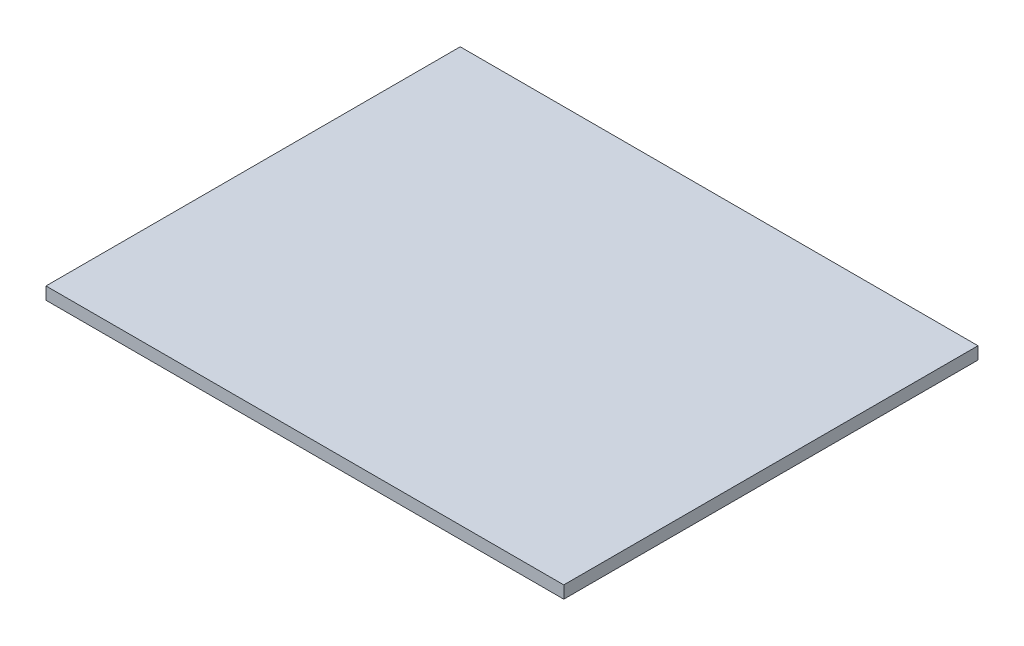
ISO-10303-21;
HEADER;
FILE_DESCRIPTION(('STEP AP214'),'2;1');
FILE_NAME('part.step','',(''),(''),'','','');
FILE_SCHEMA(('AUTOMOTIVE_DESIGN { 1 0 10303 214 1 1 1 1 }'));
ENDSEC;
DATA;
#1=APPLICATION_CONTEXT('core data for automotive mechanical design processes');
#2=APPLICATION_PROTOCOL_DEFINITION('international standard','automotive_design',2000,#1);
#3=PRODUCT_CONTEXT('',#1,'mechanical');
#4=PRODUCT('Part','Part','',(#3));
#5=PRODUCT_RELATED_PRODUCT_CATEGORY('part','',(#4));
#6=PRODUCT_DEFINITION_FORMATION('','',#4);
#7=PRODUCT_DEFINITION_CONTEXT('part definition',#1,'design');
#8=PRODUCT_DEFINITION('design','',#6,#7);
#9=PRODUCT_DEFINITION_SHAPE('','',#8);
#10=(LENGTH_UNIT() NAMED_UNIT(*) SI_UNIT(.MILLI.,.METRE.));
#11=(NAMED_UNIT(*) PLANE_ANGLE_UNIT() SI_UNIT($,.RADIAN.));
#12=(NAMED_UNIT(*) SI_UNIT($,.STERADIAN.) SOLID_ANGLE_UNIT());
#13=UNCERTAINTY_MEASURE_WITH_UNIT(LENGTH_MEASURE(1.E-05),#10,'distance_accuracy_value','');
#14=(GEOMETRIC_REPRESENTATION_CONTEXT(3) GLOBAL_UNCERTAINTY_ASSIGNED_CONTEXT((#13)) GLOBAL_UNIT_ASSIGNED_CONTEXT((#10,
#11,#12)) REPRESENTATION_CONTEXT('',''));
#15=CARTESIAN_POINT('',(0.,0.,0.));
#16=DIRECTION('',(0.,0.,1.));
#17=DIRECTION('',(1.,0.,0.));
#18=AXIS2_PLACEMENT_3D('',#15,#16,#17);
#19=CARTESIAN_POINT('',(12.5,0.6,10.));
#20=DIRECTION('',(-1.,0.,0.));
#21=DIRECTION('',(0.,0.,1.));
#22=AXIS2_PLACEMENT_3D('',#19,#20,#21);
#23=PLANE('',#22);
#24=DIRECTION('',(0.,0.,-1.));
#25=VECTOR('',#24,1.);
#26=CARTESIAN_POINT('',(12.5,0.,10.));
#27=LINE('',#26,#25);
#28=CARTESIAN_POINT('',(12.5,0.,10.));
#29=VERTEX_POINT('',#28);
#30=CARTESIAN_POINT('',(12.5,0.,-10.));
#31=VERTEX_POINT('',#30);
#32=EDGE_CURVE('E95',#29,#31,#27,.T.);
#33=ORIENTED_EDGE('',*,*,#32,.T.);
#34=DIRECTION('',(0.,-1.,0.));
#35=VECTOR('',#34,1.);
#36=CARTESIAN_POINT('',(12.5,0.6,-10.));
#37=LINE('',#36,#35);
#38=CARTESIAN_POINT('',(12.5,0.6,-10.));
#39=VERTEX_POINT('',#38);
#40=EDGE_CURVE('E11',#39,#31,#37,.T.);
#41=ORIENTED_EDGE('',*,*,#40,.F.);
#42=DIRECTION('',(0.,0.,-1.));
#43=VECTOR('',#42,1.);
#44=CARTESIAN_POINT('',(12.5,0.6,10.));
#45=LINE('',#44,#43);
#46=CARTESIAN_POINT('',(12.5,0.6,10.));
#47=VERTEX_POINT('',#46);
#48=EDGE_CURVE('E83',#47,#39,#45,.T.);
#49=ORIENTED_EDGE('',*,*,#48,.F.);
#50=DIRECTION('',(0.,-1.,0.));
#51=VECTOR('',#50,1.);
#52=CARTESIAN_POINT('',(12.5,0.6,10.));
#53=LINE('',#52,#51);
#54=EDGE_CURVE('E91',#47,#29,#53,.T.);
#55=ORIENTED_EDGE('',*,*,#54,.T.);
#56=EDGE_LOOP('',(#33,#41,#49,#55));
#57=FACE_BOUND('',#56,.T.);
#58=ADVANCED_FACE('F32',(#57),#23,.F.);
#59=CARTESIAN_POINT('',(-12.5,0.6,-10.));
#60=DIRECTION('',(0.,0.,1.));
#61=DIRECTION('',(1.,0.,0.));
#62=AXIS2_PLACEMENT_3D('',#59,#60,#61);
#63=PLANE('',#62);
#64=DIRECTION('',(-1.,0.,0.));
#65=VECTOR('',#64,1.);
#66=CARTESIAN_POINT('',(-12.5,0.,-10.));
#67=LINE('',#66,#65);
#68=CARTESIAN_POINT('',(-12.5,0.,-10.));
#69=VERTEX_POINT('',#68);
#70=EDGE_CURVE('E87',#31,#69,#67,.T.);
#71=ORIENTED_EDGE('',*,*,#70,.T.);
#72=DIRECTION('',(0.,-1.,0.));
#73=VECTOR('',#72,1.);
#74=CARTESIAN_POINT('',(-12.5,0.6,-10.));
#75=LINE('',#74,#73);
#76=CARTESIAN_POINT('',(-12.5,0.6,-10.));
#77=VERTEX_POINT('',#76);
#78=EDGE_CURVE('E40',#77,#69,#75,.T.);
#79=ORIENTED_EDGE('',*,*,#78,.F.);
#80=DIRECTION('',(-1.,0.,0.));
#81=VECTOR('',#80,1.);
#82=CARTESIAN_POINT('',(-12.5,0.6,-10.));
#83=LINE('',#82,#81);
#84=EDGE_CURVE('E78',#39,#77,#83,.T.);
#85=ORIENTED_EDGE('',*,*,#84,.F.);
#86=ORIENTED_EDGE('',*,*,#40,.T.);
#87=EDGE_LOOP('',(#71,#79,#85,#86));
#88=FACE_BOUND('',#87,.T.);
#89=ADVANCED_FACE('F86',(#88),#63,.F.);
#90=CARTESIAN_POINT('',(-12.5,0.6,10.));
#91=DIRECTION('',(1.,0.,0.));
#92=DIRECTION('',(0.,0.,-1.));
#93=AXIS2_PLACEMENT_3D('',#90,#91,#92);
#94=PLANE('',#93);
#95=DIRECTION('',(0.,0.,1.));
#96=VECTOR('',#95,1.);
#97=CARTESIAN_POINT('',(-12.5,0.,10.));
#98=LINE('',#97,#96);
#99=CARTESIAN_POINT('',(-12.5,0.,10.));
#100=VERTEX_POINT('',#99);
#101=EDGE_CURVE('E65',#69,#100,#98,.T.);
#102=ORIENTED_EDGE('',*,*,#101,.T.);
#103=DIRECTION('',(0.,-1.,0.));
#104=VECTOR('',#103,1.);
#105=CARTESIAN_POINT('',(-12.5,0.6,10.));
#106=LINE('',#105,#104);
#107=CARTESIAN_POINT('',(-12.5,0.6,10.));
#108=VERTEX_POINT('',#107);
#109=EDGE_CURVE('E88',#108,#100,#106,.T.);
#110=ORIENTED_EDGE('',*,*,#109,.F.);
#111=DIRECTION('',(0.,0.,1.));
#112=VECTOR('',#111,1.);
#113=CARTESIAN_POINT('',(-12.5,0.6,10.));
#114=LINE('',#113,#112);
#115=EDGE_CURVE('E81',#77,#108,#114,.T.);
#116=ORIENTED_EDGE('',*,*,#115,.F.);
#117=ORIENTED_EDGE('',*,*,#78,.T.);
#118=EDGE_LOOP('',(#102,#110,#116,#117));
#119=FACE_BOUND('',#118,.T.);
#120=ADVANCED_FACE('F89',(#119),#94,.F.);
#121=CARTESIAN_POINT('',(-12.5,0.6,10.));
#122=DIRECTION('',(0.,0.,-1.));
#123=DIRECTION('',(-1.,0.,0.));
#124=AXIS2_PLACEMENT_3D('',#121,#122,#123);
#125=PLANE('',#124);
#126=DIRECTION('',(1.,0.,0.));
#127=VECTOR('',#126,1.);
#128=CARTESIAN_POINT('',(-12.5,0.,10.));
#129=LINE('',#128,#127);
#130=EDGE_CURVE('E71',#100,#29,#129,.T.);
#131=ORIENTED_EDGE('',*,*,#130,.T.);
#132=ORIENTED_EDGE('',*,*,#54,.F.);
#133=DIRECTION('',(1.,0.,0.));
#134=VECTOR('',#133,1.);
#135=CARTESIAN_POINT('',(-12.5,0.6,10.));
#136=LINE('',#135,#134);
#137=EDGE_CURVE('E48',#108,#47,#136,.T.);
#138=ORIENTED_EDGE('',*,*,#137,.F.);
#139=ORIENTED_EDGE('',*,*,#109,.T.);
#140=EDGE_LOOP('',(#131,#132,#138,#139));
#141=FACE_BOUND('',#140,.T.);
#142=ADVANCED_FACE('F102',(#141),#125,.F.);
#143=CARTESIAN_POINT('',(0.,0.6,0.));
#144=DIRECTION('',(0.,-1.,0.));
#145=DIRECTION('',(0.,0.,-1.));
#146=AXIS2_PLACEMENT_3D('',#143,#144,#145);
#147=PLANE('',#146);
#148=ORIENTED_EDGE('',*,*,#48,.T.);
#149=ORIENTED_EDGE('',*,*,#84,.T.);
#150=ORIENTED_EDGE('',*,*,#115,.T.);
#151=ORIENTED_EDGE('',*,*,#137,.T.);
#152=EDGE_LOOP('',(#148,#149,#150,#151));
#153=FACE_BOUND('',#152,.T.);
#154=ADVANCED_FACE('F79',(#153),#147,.F.);
#155=CARTESIAN_POINT('',(0.,0.,0.));
#156=DIRECTION('',(0.,-1.,0.));
#157=DIRECTION('',(0.,0.,-1.));
#158=AXIS2_PLACEMENT_3D('',#155,#156,#157);
#159=PLANE('',#158);
#160=ORIENTED_EDGE('',*,*,#32,.F.);
#161=ORIENTED_EDGE('',*,*,#130,.F.);
#162=ORIENTED_EDGE('',*,*,#101,.F.);
#163=ORIENTED_EDGE('',*,*,#70,.F.);
#164=EDGE_LOOP('',(#160,#161,#162,#163));
#165=FACE_BOUND('',#164,.T.);
#166=ADVANCED_FACE('F105',(#165),#159,.T.);
#167=CLOSED_SHELL('',(#58,#89,#120,#142,#154,#166));
#168=MANIFOLD_SOLID_BREP('B2',#167);
#169=ADVANCED_BREP_SHAPE_REPRESENTATION('',(#18,#168),#14);
#170=SHAPE_DEFINITION_REPRESENTATION(#9,#169);
ENDSEC;
END-ISO-10303-21;
